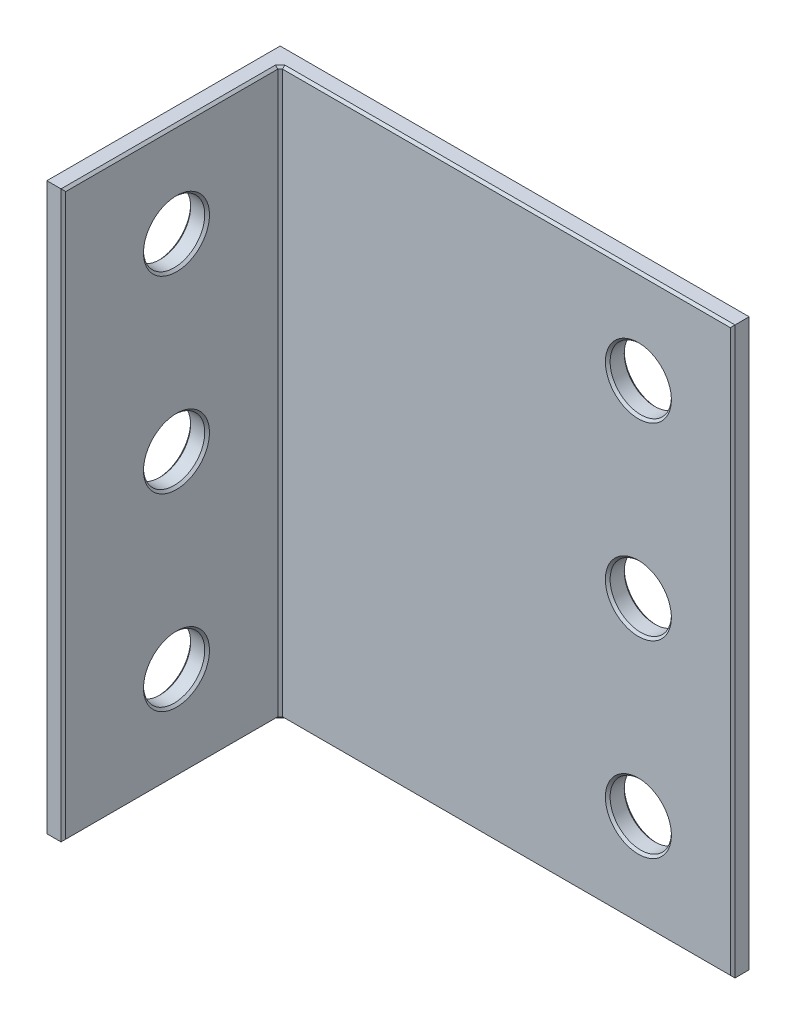
ISO-10303-21;
HEADER;
FILE_DESCRIPTION(('STEP AP214'),'2;1');
FILE_NAME('part.step','',(''),(''),'','','');
FILE_SCHEMA(('AUTOMOTIVE_DESIGN { 1 0 10303 214 1 1 1 1 }'));
ENDSEC;
DATA;
#1=APPLICATION_CONTEXT('core data for automotive mechanical design processes');
#2=APPLICATION_PROTOCOL_DEFINITION('international standard','automotive_design',2000,#1);
#3=PRODUCT_CONTEXT('',#1,'mechanical');
#4=PRODUCT('Part','Part','',(#3));
#5=PRODUCT_RELATED_PRODUCT_CATEGORY('part','',(#4));
#6=PRODUCT_DEFINITION_FORMATION('','',#4);
#7=PRODUCT_DEFINITION_CONTEXT('part definition',#1,'design');
#8=PRODUCT_DEFINITION('design','',#6,#7);
#9=PRODUCT_DEFINITION_SHAPE('','',#8);
#10=(LENGTH_UNIT() NAMED_UNIT(*) SI_UNIT(.MILLI.,.METRE.));
#11=(NAMED_UNIT(*) PLANE_ANGLE_UNIT() SI_UNIT($,.RADIAN.));
#12=(NAMED_UNIT(*) SI_UNIT($,.STERADIAN.) SOLID_ANGLE_UNIT());
#13=UNCERTAINTY_MEASURE_WITH_UNIT(LENGTH_MEASURE(1.E-05),#10,'distance_accuracy_value','');
#14=(GEOMETRIC_REPRESENTATION_CONTEXT(3) GLOBAL_UNCERTAINTY_ASSIGNED_CONTEXT((#13)) GLOBAL_UNIT_ASSIGNED_CONTEXT((#10,
#11,#12)) REPRESENTATION_CONTEXT('',''));
#15=CARTESIAN_POINT('',(0.,0.,0.));
#16=DIRECTION('',(0.,0.,1.));
#17=DIRECTION('',(1.,0.,0.));
#18=AXIS2_PLACEMENT_3D('',#15,#16,#17);
#19=CARTESIAN_POINT('',(0.,0.,8.));
#20=DIRECTION('',(0.,1.,0.));
#21=DIRECTION('',(0.,0.,1.));
#22=AXIS2_PLACEMENT_3D('',#19,#20,#21);
#23=PLANE('',#22);
#24=DIRECTION('',(0.,0.,-1.));
#25=VECTOR('',#24,1.);
#26=CARTESIAN_POINT('',(1.,0.,8.));
#27=LINE('',#26,#25);
#28=CARTESIAN_POINT('',(1.,0.,100.));
#29=VERTEX_POINT('',#28);
#30=CARTESIAN_POINT('',(1.,0.,1.));
#31=VERTEX_POINT('',#30);
#32=EDGE_CURVE('E338',#29,#31,#27,.T.);
#33=ORIENTED_EDGE('',*,*,#32,.T.);
#34=DIRECTION('',(1.,0.,0.));
#35=VECTOR('',#34,1.);
#36=CARTESIAN_POINT('',(200.,0.,1.));
#37=LINE('',#36,#35);
#38=CARTESIAN_POINT('',(200.,0.,1.));
#39=VERTEX_POINT('',#38);
#40=EDGE_CURVE('E340',#31,#39,#37,.T.);
#41=ORIENTED_EDGE('',*,*,#40,.T.);
#42=DIRECTION('',(0.,0.,-1.));
#43=VECTOR('',#42,1.);
#44=CARTESIAN_POINT('',(200.,0.,8.));
#45=LINE('',#44,#43);
#46=CARTESIAN_POINT('',(200.,0.,6.99999999999999));
#47=VERTEX_POINT('',#46);
#48=EDGE_CURVE('E352',#47,#39,#45,.T.);
#49=ORIENTED_EDGE('',*,*,#48,.F.);
#50=DIRECTION('',(-1.,0.,0.));
#51=VECTOR('',#50,1.);
#52=CARTESIAN_POINT('',(0.,0.,6.99999999999999));
#53=LINE('',#52,#51);
#54=CARTESIAN_POINT('',(9.00000000000002,0.,6.99999999999999));
#55=VERTEX_POINT('',#54);
#56=EDGE_CURVE('E334',#47,#55,#53,.T.);
#57=ORIENTED_EDGE('',*,*,#56,.T.);
#58=DIRECTION('',(0.707106781186544,0.,-0.707106781186551));
#59=VECTOR('',#58,1.);
#60=CARTESIAN_POINT('',(9.00000000000002,0.,6.99999999999999));
#61=LINE('',#60,#59);
#62=CARTESIAN_POINT('',(8.00000000000001,0.,8.));
#63=VERTEX_POINT('',#62);
#64=EDGE_CURVE('E330',#63,#55,#61,.T.);
#65=ORIENTED_EDGE('',*,*,#64,.F.);
#66=DIRECTION('',(0.707106781186544,0.,-0.707106781186551));
#67=VECTOR('',#66,1.);
#68=CARTESIAN_POINT('',(9.00000000000002,0.,6.99999999999999));
#69=LINE('',#68,#67);
#70=CARTESIAN_POINT('',(7.00000000000003,0.,9.00000000000001));
#71=VERTEX_POINT('',#70);
#72=EDGE_CURVE('E287',#71,#63,#69,.T.);
#73=ORIENTED_EDGE('',*,*,#72,.F.);
#74=DIRECTION('',(0.,0.,1.));
#75=VECTOR('',#74,1.);
#76=CARTESIAN_POINT('',(7.00000000000003,0.,8.));
#77=LINE('',#76,#75);
#78=CARTESIAN_POINT('',(7.00000000000003,0.,100.));
#79=VERTEX_POINT('',#78);
#80=EDGE_CURVE('E292',#71,#79,#77,.T.);
#81=ORIENTED_EDGE('',*,*,#80,.T.);
#82=DIRECTION('',(1.,0.,0.));
#83=VECTOR('',#82,1.);
#84=CARTESIAN_POINT('',(0.,0.,100.));
#85=LINE('',#84,#83);
#86=EDGE_CURVE('E256',#29,#79,#85,.T.);
#87=ORIENTED_EDGE('',*,*,#86,.F.);
#88=EDGE_LOOP('',(#33,#41,#49,#57,#65,#73,#81,#87));
#89=FACE_BOUND('',#88,.T.);
#90=ADVANCED_FACE('F32',(#89),#23,.F.);
#91=CARTESIAN_POINT('',(0.,240.,8.));
#92=DIRECTION('',(0.,0.,-1.));
#93=DIRECTION('',(-1.,0.,0.));
#94=AXIS2_PLACEMENT_3D('',#91,#92,#93);
#95=PLANE('',#94);
#96=CARTESIAN_POINT('',(160.,120.,8.));
#97=DIRECTION('',(0.,0.,-1.));
#98=DIRECTION('',(-1.,0.,0.));
#99=AXIS2_PLACEMENT_3D('',#96,#97,#98);
#100=CIRCLE('',#99,14.);
#101=CARTESIAN_POINT('',(146.,120.,8.));
#102=VERTEX_POINT('',#101);
#103=EDGE_CURVE('E325',#102,#102,#100,.T.);
#104=ORIENTED_EDGE('',*,*,#103,.T.);
#105=EDGE_LOOP('',(#104));
#106=FACE_BOUND('',#105,.T.);
#107=CARTESIAN_POINT('',(160.,40.,8.));
#108=DIRECTION('',(0.,0.,-1.));
#109=DIRECTION('',(-1.,0.,0.));
#110=AXIS2_PLACEMENT_3D('',#107,#108,#109);
#111=CIRCLE('',#110,14.);
#112=CARTESIAN_POINT('',(146.,40.,8.));
#113=VERTEX_POINT('',#112);
#114=EDGE_CURVE('E318',#113,#113,#111,.T.);
#115=ORIENTED_EDGE('',*,*,#114,.T.);
#116=EDGE_LOOP('',(#115));
#117=FACE_BOUND('',#116,.T.);
#118=CARTESIAN_POINT('',(160.,200.,8.));
#119=DIRECTION('',(0.,0.,-1.));
#120=DIRECTION('',(-1.,0.,0.));
#121=AXIS2_PLACEMENT_3D('',#118,#119,#120);
#122=CIRCLE('',#121,14.);
#123=CARTESIAN_POINT('',(146.,200.,8.));
#124=VERTEX_POINT('',#123);
#125=EDGE_CURVE('E315',#124,#124,#122,.T.);
#126=ORIENTED_EDGE('',*,*,#125,.T.);
#127=EDGE_LOOP('',(#126));
#128=FACE_BOUND('',#127,.T.);
#129=DIRECTION('',(0.,1.,0.));
#130=VECTOR('',#129,1.);
#131=CARTESIAN_POINT('',(199.,240.,8.));
#132=LINE('',#131,#130);
#133=CARTESIAN_POINT('',(199.,1.,8.));
#134=VERTEX_POINT('',#133);
#135=CARTESIAN_POINT('',(199.,239.,8.));
#136=VERTEX_POINT('',#135);
#137=EDGE_CURVE('E312',#134,#136,#132,.T.);
#138=ORIENTED_EDGE('',*,*,#137,.T.);
#139=DIRECTION('',(-1.,0.,0.));
#140=VECTOR('',#139,1.);
#141=CARTESIAN_POINT('',(0.,239.,8.));
#142=LINE('',#141,#140);
#143=CARTESIAN_POINT('',(9.,239.,8.));
#144=VERTEX_POINT('',#143);
#145=EDGE_CURVE('E309',#136,#144,#142,.T.);
#146=ORIENTED_EDGE('',*,*,#145,.T.);
#147=DIRECTION('',(0.,-1.,0.));
#148=VECTOR('',#147,1.);
#149=CARTESIAN_POINT('',(9.00000000000002,0.,8.));
#150=LINE('',#149,#148);
#151=CARTESIAN_POINT('',(9.00000000000002,1.,8.));
#152=VERTEX_POINT('',#151);
#153=EDGE_CURVE('E302',#144,#152,#150,.T.);
#154=ORIENTED_EDGE('',*,*,#153,.T.);
#155=DIRECTION('',(1.,0.,0.));
#156=VECTOR('',#155,1.);
#157=CARTESIAN_POINT('',(0.,1.,8.));
#158=LINE('',#157,#156);
#159=EDGE_CURVE('E305',#152,#134,#158,.T.);
#160=ORIENTED_EDGE('',*,*,#159,.T.);
#161=EDGE_LOOP('',(#138,#146,#154,#160));
#162=FACE_BOUND('',#161,.T.);
#163=ADVANCED_FACE('F310',(#106,#117,#128,#162),#95,.F.);
#164=CARTESIAN_POINT('',(0.,240.,0.));
#165=DIRECTION('',(0.,0.,-1.));
#166=DIRECTION('',(-1.,0.,0.));
#167=AXIS2_PLACEMENT_3D('',#164,#165,#166);
#168=PLANE('',#167);
#169=CARTESIAN_POINT('',(160.,200.,0.));
#170=DIRECTION('',(0.,0.,-1.));
#171=DIRECTION('',(-1.,0.,0.));
#172=AXIS2_PLACEMENT_3D('',#169,#170,#171);
#173=CIRCLE('',#172,14.);
#174=CARTESIAN_POINT('',(146.,200.,0.));
#175=VERTEX_POINT('',#174);
#176=EDGE_CURVE('E384',#175,#175,#173,.F.);
#177=ORIENTED_EDGE('',*,*,#176,.T.);
#178=EDGE_LOOP('',(#177));
#179=FACE_BOUND('',#178,.T.);
#180=CARTESIAN_POINT('',(160.,40.,0.));
#181=DIRECTION('',(0.,0.,-1.));
#182=DIRECTION('',(-1.,0.,0.));
#183=AXIS2_PLACEMENT_3D('',#180,#181,#182);
#184=CIRCLE('',#183,14.);
#185=CARTESIAN_POINT('',(146.,40.,0.));
#186=VERTEX_POINT('',#185);
#187=EDGE_CURVE('E381',#186,#186,#184,.F.);
#188=ORIENTED_EDGE('',*,*,#187,.T.);
#189=EDGE_LOOP('',(#188));
#190=FACE_BOUND('',#189,.T.);
#191=CARTESIAN_POINT('',(160.,120.,0.));
#192=DIRECTION('',(0.,0.,-1.));
#193=DIRECTION('',(-1.,0.,0.));
#194=AXIS2_PLACEMENT_3D('',#191,#192,#193);
#195=CIRCLE('',#194,14.);
#196=CARTESIAN_POINT('',(146.,120.,0.));
#197=VERTEX_POINT('',#196);
#198=EDGE_CURVE('E373',#197,#197,#195,.F.);
#199=ORIENTED_EDGE('',*,*,#198,.T.);
#200=EDGE_LOOP('',(#199));
#201=FACE_BOUND('',#200,.T.);
#202=DIRECTION('',(0.,-1.,0.));
#203=VECTOR('',#202,1.);
#204=CARTESIAN_POINT('',(199.,0.,0.));
#205=LINE('',#204,#203);
#206=CARTESIAN_POINT('',(199.,239.,0.));
#207=VERTEX_POINT('',#206);
#208=CARTESIAN_POINT('',(199.,1.,0.));
#209=VERTEX_POINT('',#208);
#210=EDGE_CURVE('E366',#207,#209,#205,.T.);
#211=ORIENTED_EDGE('',*,*,#210,.T.);
#212=DIRECTION('',(-1.,0.,0.));
#213=VECTOR('',#212,1.);
#214=CARTESIAN_POINT('',(0.,1.,0.));
#215=LINE('',#214,#213);
#216=CARTESIAN_POINT('',(1.,1.,0.));
#217=VERTEX_POINT('',#216);
#218=EDGE_CURVE('E370',#209,#217,#215,.T.);
#219=ORIENTED_EDGE('',*,*,#218,.T.);
#220=DIRECTION('',(0.,1.,0.));
#221=VECTOR('',#220,1.);
#222=CARTESIAN_POINT('',(1.,240.,0.));
#223=LINE('',#222,#221);
#224=CARTESIAN_POINT('',(1.,239.,0.));
#225=VERTEX_POINT('',#224);
#226=EDGE_CURVE('E375',#217,#225,#223,.T.);
#227=ORIENTED_EDGE('',*,*,#226,.T.);
#228=DIRECTION('',(1.,0.,0.));
#229=VECTOR('',#228,1.);
#230=CARTESIAN_POINT('',(200.,239.,0.));
#231=LINE('',#230,#229);
#232=EDGE_CURVE('E371',#225,#207,#231,.T.);
#233=ORIENTED_EDGE('',*,*,#232,.T.);
#234=EDGE_LOOP('',(#211,#219,#227,#233));
#235=FACE_BOUND('',#234,.T.);
#236=ADVANCED_FACE('F430',(#179,#190,#201,#235),#168,.T.);
#237=CARTESIAN_POINT('',(0.,0.,8.));
#238=DIRECTION('',(1.,0.,0.));
#239=DIRECTION('',(0.,0.,-1.));
#240=AXIS2_PLACEMENT_3D('',#237,#238,#239);
#241=PLANE('',#240);
#242=DIRECTION('',(0.,1.,0.));
#243=VECTOR('',#242,1.);
#244=CARTESIAN_POINT('',(0.,240.,99.));
#245=LINE('',#244,#243);
#246=CARTESIAN_POINT('',(0.,1.,99.));
#247=VERTEX_POINT('',#246);
#248=CARTESIAN_POINT('',(0.,239.,99.));
#249=VERTEX_POINT('',#248);
#250=EDGE_CURVE('E188',#247,#249,#245,.T.);
#251=ORIENTED_EDGE('',*,*,#250,.T.);
#252=DIRECTION('',(0.,0.,-1.));
#253=VECTOR('',#252,1.);
#254=CARTESIAN_POINT('',(0.,239.,8.));
#255=LINE('',#254,#253);
#256=CARTESIAN_POINT('',(0.,239.,1.));
#257=VERTEX_POINT('',#256);
#258=EDGE_CURVE('E190',#249,#257,#255,.T.);
#259=ORIENTED_EDGE('',*,*,#258,.T.);
#260=DIRECTION('',(0.,-1.,0.));
#261=VECTOR('',#260,1.);
#262=CARTESIAN_POINT('',(0.,0.,1.));
#263=LINE('',#262,#261);
#264=CARTESIAN_POINT('',(0.,1.,1.));
#265=VERTEX_POINT('',#264);
#266=EDGE_CURVE('E184',#257,#265,#263,.T.);
#267=ORIENTED_EDGE('',*,*,#266,.T.);
#268=DIRECTION('',(0.,0.,1.));
#269=VECTOR('',#268,1.);
#270=CARTESIAN_POINT('',(0.,1.,8.));
#271=LINE('',#270,#269);
#272=EDGE_CURVE('E186',#265,#247,#271,.T.);
#273=ORIENTED_EDGE('',*,*,#272,.T.);
#274=EDGE_LOOP('',(#251,#259,#267,#273));
#275=FACE_BOUND('',#274,.T.);
#276=CARTESIAN_POINT('',(0.,200.,52.));
#277=DIRECTION('',(1.,0.,0.));
#278=DIRECTION('',(0.,0.,-1.));
#279=AXIS2_PLACEMENT_3D('',#276,#277,#278);
#280=CIRCLE('',#279,14.);
#281=CARTESIAN_POINT('',(0.,200.,38.));
#282=VERTEX_POINT('',#281);
#283=EDGE_CURVE('E181',#282,#282,#280,.T.);
#284=ORIENTED_EDGE('',*,*,#283,.T.);
#285=EDGE_LOOP('',(#284));
#286=FACE_BOUND('',#285,.T.);
#287=CARTESIAN_POINT('',(0.,120.,52.));
#288=DIRECTION('',(1.,0.,0.));
#289=DIRECTION('',(0.,0.,-1.));
#290=AXIS2_PLACEMENT_3D('',#287,#288,#289);
#291=CIRCLE('',#290,14.);
#292=CARTESIAN_POINT('',(0.,120.,38.));
#293=VERTEX_POINT('',#292);
#294=EDGE_CURVE('E178',#293,#293,#291,.T.);
#295=ORIENTED_EDGE('',*,*,#294,.T.);
#296=EDGE_LOOP('',(#295));
#297=FACE_BOUND('',#296,.T.);
#298=CARTESIAN_POINT('',(0.,40.,52.));
#299=DIRECTION('',(1.,0.,0.));
#300=DIRECTION('',(0.,0.,-1.));
#301=AXIS2_PLACEMENT_3D('',#298,#299,#300);
#302=CIRCLE('',#301,14.);
#303=CARTESIAN_POINT('',(0.,40.,38.));
#304=VERTEX_POINT('',#303);
#305=EDGE_CURVE('E175',#304,#304,#302,.T.);
#306=ORIENTED_EDGE('',*,*,#305,.T.);
#307=EDGE_LOOP('',(#306));
#308=FACE_BOUND('',#307,.T.);
#309=ADVANCED_FACE('F436',(#275,#286,#297,#308),#241,.F.);
#310=CARTESIAN_POINT('',(200.,0.,8.));
#311=DIRECTION('',(-1.,0.,0.));
#312=DIRECTION('',(0.,0.,1.));
#313=AXIS2_PLACEMENT_3D('',#310,#311,#312);
#314=PLANE('',#313);
#315=ORIENTED_EDGE('',*,*,#48,.T.);
#316=DIRECTION('',(0.,1.,0.));
#317=VECTOR('',#316,1.);
#318=CARTESIAN_POINT('',(200.,240.,1.));
#319=LINE('',#318,#317);
#320=CARTESIAN_POINT('',(200.,240.,1.));
#321=VERTEX_POINT('',#320);
#322=EDGE_CURVE('E156',#39,#321,#319,.T.);
#323=ORIENTED_EDGE('',*,*,#322,.T.);
#324=DIRECTION('',(0.,0.,-1.));
#325=VECTOR('',#324,1.);
#326=CARTESIAN_POINT('',(200.,240.,8.));
#327=LINE('',#326,#325);
#328=CARTESIAN_POINT('',(200.,240.,6.99999999999999));
#329=VERTEX_POINT('',#328);
#330=EDGE_CURVE('E350',#329,#321,#327,.T.);
#331=ORIENTED_EDGE('',*,*,#330,.F.);
#332=DIRECTION('',(0.,-1.,0.));
#333=VECTOR('',#332,1.);
#334=CARTESIAN_POINT('',(200.,0.,6.99999999999999));
#335=LINE('',#334,#333);
#336=EDGE_CURVE('E343',#329,#47,#335,.T.);
#337=ORIENTED_EDGE('',*,*,#336,.T.);
#338=EDGE_LOOP('',(#315,#323,#331,#337));
#339=FACE_BOUND('',#338,.T.);
#340=ADVANCED_FACE('F349',(#339),#314,.F.);
#341=CARTESIAN_POINT('',(0.,240.,8.));
#342=DIRECTION('',(0.,-1.,0.));
#343=DIRECTION('',(0.,0.,-1.));
#344=AXIS2_PLACEMENT_3D('',#341,#342,#343);
#345=PLANE('',#344);
#346=ORIENTED_EDGE('',*,*,#330,.T.);
#347=DIRECTION('',(-1.,0.,0.));
#348=VECTOR('',#347,1.);
#349=CARTESIAN_POINT('',(0.,240.,1.));
#350=LINE('',#349,#348);
#351=CARTESIAN_POINT('',(1.,240.,1.));
#352=VERTEX_POINT('',#351);
#353=EDGE_CURVE('E173',#321,#352,#350,.T.);
#354=ORIENTED_EDGE('',*,*,#353,.T.);
#355=DIRECTION('',(0.,0.,1.));
#356=VECTOR('',#355,1.);
#357=CARTESIAN_POINT('',(1.,240.,8.));
#358=LINE('',#357,#356);
#359=CARTESIAN_POINT('',(1.,240.,100.));
#360=VERTEX_POINT('',#359);
#361=EDGE_CURVE('E171',#352,#360,#358,.T.);
#362=ORIENTED_EDGE('',*,*,#361,.T.);
#363=DIRECTION('',(-1.,0.,0.));
#364=VECTOR('',#363,1.);
#365=CARTESIAN_POINT('',(0.,240.,100.));
#366=LINE('',#365,#364);
#367=CARTESIAN_POINT('',(7.,240.,100.));
#368=VERTEX_POINT('',#367);
#369=EDGE_CURVE('E357',#368,#360,#366,.T.);
#370=ORIENTED_EDGE('',*,*,#369,.F.);
#371=DIRECTION('',(0.,0.,-1.));
#372=VECTOR('',#371,1.);
#373=CARTESIAN_POINT('',(7.,240.,8.));
#374=LINE('',#373,#372);
#375=CARTESIAN_POINT('',(7.,240.,9.00000000000001));
#376=VERTEX_POINT('',#375);
#377=EDGE_CURVE('E152',#368,#376,#374,.T.);
#378=ORIENTED_EDGE('',*,*,#377,.T.);
#379=DIRECTION('',(-0.707106781186544,0.,0.707106781186551));
#380=VECTOR('',#379,1.);
#381=CARTESIAN_POINT('',(7.,240.,9.00000000000001));
#382=LINE('',#381,#380);
#383=CARTESIAN_POINT('',(8.,240.,8.));
#384=VERTEX_POINT('',#383);
#385=EDGE_CURVE('E143',#384,#376,#382,.T.);
#386=ORIENTED_EDGE('',*,*,#385,.F.);
#387=DIRECTION('',(-0.707106781186544,0.,0.707106781186551));
#388=VECTOR('',#387,1.);
#389=CARTESIAN_POINT('',(7.,240.,9.00000000000001));
#390=LINE('',#389,#388);
#391=CARTESIAN_POINT('',(9.,240.,6.99999999999999));
#392=VERTEX_POINT('',#391);
#393=EDGE_CURVE('E148',#392,#384,#390,.T.);
#394=ORIENTED_EDGE('',*,*,#393,.F.);
#395=DIRECTION('',(1.,0.,0.));
#396=VECTOR('',#395,1.);
#397=CARTESIAN_POINT('',(0.,240.,6.99999999999999));
#398=LINE('',#397,#396);
#399=EDGE_CURVE('E163',#392,#329,#398,.T.);
#400=ORIENTED_EDGE('',*,*,#399,.T.);
#401=EDGE_LOOP('',(#346,#354,#362,#370,#378,#386,#394,#400));
#402=FACE_BOUND('',#401,.T.);
#403=ADVANCED_FACE('F146',(#402),#345,.F.);
#404=CARTESIAN_POINT('',(160.,40.,8.));
#405=DIRECTION('',(0.,0.,-1.));
#406=DIRECTION('',(-1.,0.,0.));
#407=AXIS2_PLACEMENT_3D('',#404,#405,#406);
#408=CYLINDRICAL_SURFACE('',#407,13.);
#409=CARTESIAN_POINT('',(160.,40.,1.00000000000001));
#410=DIRECTION('',(0.,0.,-1.));
#411=DIRECTION('',(-1.,0.,0.));
#412=AXIS2_PLACEMENT_3D('',#409,#410,#411);
#413=CIRCLE('',#412,13.);
#414=CARTESIAN_POINT('',(147.,40.,1.00000000000001));
#415=VERTEX_POINT('',#414);
#416=EDGE_CURVE('E396',#415,#415,#413,.T.);
#417=ORIENTED_EDGE('',*,*,#416,.T.);
#418=EDGE_LOOP('',(#417));
#419=FACE_BOUND('',#418,.T.);
#420=CARTESIAN_POINT('',(160.,40.,6.99999999999999));
#421=DIRECTION('',(0.,0.,-1.));
#422=DIRECTION('',(-1.,0.,0.));
#423=AXIS2_PLACEMENT_3D('',#420,#421,#422);
#424=CIRCLE('',#423,13.);
#425=CARTESIAN_POINT('',(147.,40.,6.99999999999999));
#426=VERTEX_POINT('',#425);
#427=EDGE_CURVE('E393',#426,#426,#424,.F.);
#428=ORIENTED_EDGE('',*,*,#427,.T.);
#429=EDGE_LOOP('',(#428));
#430=FACE_BOUND('',#429,.T.);
#431=ADVANCED_FACE('F543',(#419,#430),#408,.F.);
#432=CARTESIAN_POINT('',(160.,120.,8.));
#433=DIRECTION('',(0.,0.,-1.));
#434=DIRECTION('',(-1.,0.,0.));
#435=AXIS2_PLACEMENT_3D('',#432,#433,#434);
#436=CYLINDRICAL_SURFACE('',#435,13.);
#437=CARTESIAN_POINT('',(160.,120.,1.00000000000001));
#438=DIRECTION('',(0.,0.,-1.));
#439=DIRECTION('',(-1.,0.,0.));
#440=AXIS2_PLACEMENT_3D('',#437,#438,#439);
#441=CIRCLE('',#440,13.);
#442=CARTESIAN_POINT('',(147.,120.,1.00000000000001));
#443=VERTEX_POINT('',#442);
#444=EDGE_CURVE('E306',#443,#443,#441,.T.);
#445=ORIENTED_EDGE('',*,*,#444,.T.);
#446=EDGE_LOOP('',(#445));
#447=FACE_BOUND('',#446,.T.);
#448=CARTESIAN_POINT('',(160.,120.,6.99999999999999));
#449=DIRECTION('',(0.,0.,-1.));
#450=DIRECTION('',(-1.,0.,0.));
#451=AXIS2_PLACEMENT_3D('',#448,#449,#450);
#452=CIRCLE('',#451,13.);
#453=CARTESIAN_POINT('',(147.,120.,6.99999999999999));
#454=VERTEX_POINT('',#453);
#455=EDGE_CURVE('E399',#454,#454,#452,.F.);
#456=ORIENTED_EDGE('',*,*,#455,.T.);
#457=EDGE_LOOP('',(#456));
#458=FACE_BOUND('',#457,.T.);
#459=ADVANCED_FACE('F536',(#447,#458),#436,.F.);
#460=CARTESIAN_POINT('',(160.,200.,8.));
#461=DIRECTION('',(0.,0.,-1.));
#462=DIRECTION('',(-1.,0.,0.));
#463=AXIS2_PLACEMENT_3D('',#460,#461,#462);
#464=CYLINDRICAL_SURFACE('',#463,13.);
#465=CARTESIAN_POINT('',(160.,200.,1.));
#466=DIRECTION('',(0.,0.,-1.));
#467=DIRECTION('',(-1.,0.,0.));
#468=AXIS2_PLACEMENT_3D('',#465,#466,#467);
#469=CIRCLE('',#468,13.);
#470=CARTESIAN_POINT('',(147.,200.,1.));
#471=VERTEX_POINT('',#470);
#472=EDGE_CURVE('E390',#471,#471,#469,.T.);
#473=ORIENTED_EDGE('',*,*,#472,.T.);
#474=EDGE_LOOP('',(#473));
#475=FACE_BOUND('',#474,.T.);
#476=CARTESIAN_POINT('',(160.,200.,6.99999999999999));
#477=DIRECTION('',(0.,0.,-1.));
#478=DIRECTION('',(-1.,0.,0.));
#479=AXIS2_PLACEMENT_3D('',#476,#477,#478);
#480=CIRCLE('',#479,13.);
#481=CARTESIAN_POINT('',(147.,200.,6.99999999999999));
#482=VERTEX_POINT('',#481);
#483=EDGE_CURVE('E387',#482,#482,#480,.F.);
#484=ORIENTED_EDGE('',*,*,#483,.T.);
#485=EDGE_LOOP('',(#484));
#486=FACE_BOUND('',#485,.T.);
#487=ADVANCED_FACE('F527',(#475,#486),#464,.F.);
#488=CARTESIAN_POINT('',(8.,240.,100.));
#489=DIRECTION('',(-1.,0.,0.));
#490=DIRECTION('',(0.,-1.,0.));
#491=AXIS2_PLACEMENT_3D('',#488,#489,#490);
#492=PLANE('',#491);
#493=DIRECTION('',(0.,-1.,0.));
#494=VECTOR('',#493,1.);
#495=CARTESIAN_POINT('',(8.00000000000003,0.,99.));
#496=LINE('',#495,#494);
#497=CARTESIAN_POINT('',(8.,239.,99.));
#498=VERTEX_POINT('',#497);
#499=CARTESIAN_POINT('',(8.00000000000003,1.,99.));
#500=VERTEX_POINT('',#499);
#501=EDGE_CURVE('E41',#498,#500,#496,.T.);
#502=ORIENTED_EDGE('',*,*,#501,.T.);
#503=DIRECTION('',(0.,0.,-1.));
#504=VECTOR('',#503,1.);
#505=CARTESIAN_POINT('',(8.00000000000003,1.,100.));
#506=LINE('',#505,#504);
#507=CARTESIAN_POINT('',(8.00000000000003,1.,9.00000000000001));
#508=VERTEX_POINT('',#507);
#509=EDGE_CURVE('E11',#500,#508,#506,.T.);
#510=ORIENTED_EDGE('',*,*,#509,.T.);
#511=DIRECTION('',(0.,1.,0.));
#512=VECTOR('',#511,1.);
#513=CARTESIAN_POINT('',(8.,240.,9.00000000000001));
#514=LINE('',#513,#512);
#515=CARTESIAN_POINT('',(8.,239.,9.00000000000001));
#516=VERTEX_POINT('',#515);
#517=EDGE_CURVE('E224',#508,#516,#514,.T.);
#518=ORIENTED_EDGE('',*,*,#517,.T.);
#519=DIRECTION('',(0.,0.,1.));
#520=VECTOR('',#519,1.);
#521=CARTESIAN_POINT('',(8.,239.,100.));
#522=LINE('',#521,#520);
#523=EDGE_CURVE('E52',#516,#498,#522,.T.);
#524=ORIENTED_EDGE('',*,*,#523,.T.);
#525=EDGE_LOOP('',(#502,#510,#518,#524));
#526=FACE_BOUND('',#525,.T.);
#527=CARTESIAN_POINT('',(8.00000000000001,200.,52.));
#528=DIRECTION('',(-1.,0.,0.));
#529=DIRECTION('',(0.,-1.,0.));
#530=AXIS2_PLACEMENT_3D('',#527,#528,#529);
#531=CIRCLE('',#530,14.);
#532=CARTESIAN_POINT('',(8.00000000000001,186.,52.));
#533=VERTEX_POINT('',#532);
#534=EDGE_CURVE('E221',#533,#533,#531,.T.);
#535=ORIENTED_EDGE('',*,*,#534,.T.);
#536=EDGE_LOOP('',(#535));
#537=FACE_BOUND('',#536,.T.);
#538=CARTESIAN_POINT('',(8.00000000000001,120.,52.));
#539=DIRECTION('',(-1.,0.,0.));
#540=DIRECTION('',(0.,-1.,0.));
#541=AXIS2_PLACEMENT_3D('',#538,#539,#540);
#542=CIRCLE('',#541,14.);
#543=CARTESIAN_POINT('',(8.00000000000002,106.,52.));
#544=VERTEX_POINT('',#543);
#545=EDGE_CURVE('E218',#544,#544,#542,.T.);
#546=ORIENTED_EDGE('',*,*,#545,.T.);
#547=EDGE_LOOP('',(#546));
#548=FACE_BOUND('',#547,.T.);
#549=CARTESIAN_POINT('',(8.00000000000002,40.,52.));
#550=DIRECTION('',(-1.,0.,0.));
#551=DIRECTION('',(0.,-1.,0.));
#552=AXIS2_PLACEMENT_3D('',#549,#550,#551);
#553=CIRCLE('',#552,14.);
#554=CARTESIAN_POINT('',(8.00000000000002,26.,52.));
#555=VERTEX_POINT('',#554);
#556=EDGE_CURVE('E215',#555,#555,#553,.T.);
#557=ORIENTED_EDGE('',*,*,#556,.T.);
#558=EDGE_LOOP('',(#557));
#559=FACE_BOUND('',#558,.T.);
#560=ADVANCED_FACE('F293',(#526,#537,#548,#559),#492,.F.);
#561=CARTESIAN_POINT('',(0.,0.,100.));
#562=DIRECTION('',(0.,0.,1.));
#563=DIRECTION('',(1.,0.,0.));
#564=AXIS2_PLACEMENT_3D('',#561,#562,#563);
#565=PLANE('',#564);
#566=ORIENTED_EDGE('',*,*,#369,.T.);
#567=DIRECTION('',(0.,-1.,0.));
#568=VECTOR('',#567,1.);
#569=CARTESIAN_POINT('',(1.,0.,100.));
#570=LINE('',#569,#568);
#571=EDGE_CURVE('E195',#360,#29,#570,.T.);
#572=ORIENTED_EDGE('',*,*,#571,.T.);
#573=ORIENTED_EDGE('',*,*,#86,.T.);
#574=DIRECTION('',(0.,1.,0.));
#575=VECTOR('',#574,1.);
#576=CARTESIAN_POINT('',(7.,240.,100.));
#577=LINE('',#576,#575);
#578=EDGE_CURVE('E193',#79,#368,#577,.T.);
#579=ORIENTED_EDGE('',*,*,#578,.T.);
#580=EDGE_LOOP('',(#566,#572,#573,#579));
#581=FACE_BOUND('',#580,.T.);
#582=ADVANCED_FACE('F526',(#581),#565,.T.);
#583=CARTESIAN_POINT('',(200.000025,200.,52.));
#584=DIRECTION('',(-1.,0.,0.));
#585=DIRECTION('',(0.,0.,1.));
#586=AXIS2_PLACEMENT_3D('',#583,#584,#585);
#587=CYLINDRICAL_SURFACE('',#586,13.);
#588=CARTESIAN_POINT('',(1.,200.,52.));
#589=DIRECTION('',(1.,0.,0.));
#590=DIRECTION('',(0.,0.,-1.));
#591=AXIS2_PLACEMENT_3D('',#588,#589,#590);
#592=CIRCLE('',#591,13.);
#593=CARTESIAN_POINT('',(1.,200.,39.));
#594=VERTEX_POINT('',#593);
#595=EDGE_CURVE('E200',#594,#594,#592,.F.);
#596=ORIENTED_EDGE('',*,*,#595,.T.);
#597=EDGE_LOOP('',(#596));
#598=FACE_BOUND('',#597,.T.);
#599=CARTESIAN_POINT('',(7.00000000000001,200.,52.));
#600=DIRECTION('',(-1.,0.,0.));
#601=DIRECTION('',(0.,0.,1.));
#602=AXIS2_PLACEMENT_3D('',#599,#600,#601);
#603=CIRCLE('',#602,13.);
#604=CARTESIAN_POINT('',(7.00000000000001,200.,65.));
#605=VERTEX_POINT('',#604);
#606=EDGE_CURVE('E197',#605,#605,#603,.F.);
#607=ORIENTED_EDGE('',*,*,#606,.T.);
#608=EDGE_LOOP('',(#607));
#609=FACE_BOUND('',#608,.T.);
#610=ADVANCED_FACE('F533',(#598,#609),#587,.F.);
#611=CARTESIAN_POINT('',(200.000025,120.,52.));
#612=DIRECTION('',(-1.,0.,0.));
#613=DIRECTION('',(0.,0.,1.));
#614=AXIS2_PLACEMENT_3D('',#611,#612,#613);
#615=CYLINDRICAL_SURFACE('',#614,13.);
#616=CARTESIAN_POINT('',(1.,120.,52.));
#617=DIRECTION('',(1.,0.,0.));
#618=DIRECTION('',(0.,0.,-1.));
#619=AXIS2_PLACEMENT_3D('',#616,#617,#618);
#620=CIRCLE('',#619,13.);
#621=CARTESIAN_POINT('',(1.,120.,39.));
#622=VERTEX_POINT('',#621);
#623=EDGE_CURVE('E206',#622,#622,#620,.F.);
#624=ORIENTED_EDGE('',*,*,#623,.T.);
#625=EDGE_LOOP('',(#624));
#626=FACE_BOUND('',#625,.T.);
#627=CARTESIAN_POINT('',(7.00000000000003,120.,52.));
#628=DIRECTION('',(-1.,0.,0.));
#629=DIRECTION('',(0.,0.,1.));
#630=AXIS2_PLACEMENT_3D('',#627,#628,#629);
#631=CIRCLE('',#630,13.);
#632=CARTESIAN_POINT('',(7.00000000000003,120.,65.));
#633=VERTEX_POINT('',#632);
#634=EDGE_CURVE('E203',#633,#633,#631,.F.);
#635=ORIENTED_EDGE('',*,*,#634,.T.);
#636=EDGE_LOOP('',(#635));
#637=FACE_BOUND('',#636,.T.);
#638=ADVANCED_FACE('F517',(#626,#637),#615,.F.);
#639=CARTESIAN_POINT('',(200.000025,40.,52.));
#640=DIRECTION('',(-1.,0.,0.));
#641=DIRECTION('',(0.,0.,1.));
#642=AXIS2_PLACEMENT_3D('',#639,#640,#641);
#643=CYLINDRICAL_SURFACE('',#642,13.);
#644=CARTESIAN_POINT('',(1.,40.,52.));
#645=DIRECTION('',(1.,0.,0.));
#646=DIRECTION('',(0.,0.,-1.));
#647=AXIS2_PLACEMENT_3D('',#644,#645,#646);
#648=CIRCLE('',#647,13.);
#649=CARTESIAN_POINT('',(1.,40.,39.));
#650=VERTEX_POINT('',#649);
#651=EDGE_CURVE('E212',#650,#650,#648,.F.);
#652=ORIENTED_EDGE('',*,*,#651,.T.);
#653=EDGE_LOOP('',(#652));
#654=FACE_BOUND('',#653,.T.);
#655=CARTESIAN_POINT('',(7.00000000000001,40.,52.));
#656=DIRECTION('',(-1.,0.,0.));
#657=DIRECTION('',(0.,0.,1.));
#658=AXIS2_PLACEMENT_3D('',#655,#656,#657);
#659=CIRCLE('',#658,13.);
#660=CARTESIAN_POINT('',(7.00000000000001,40.,65.));
#661=VERTEX_POINT('',#660);
#662=EDGE_CURVE('E209',#661,#661,#659,.F.);
#663=ORIENTED_EDGE('',*,*,#662,.T.);
#664=EDGE_LOOP('',(#663));
#665=FACE_BOUND('',#664,.T.);
#666=ADVANCED_FACE('F444',(#654,#665),#643,.F.);
#667=CARTESIAN_POINT('',(160.,200.,0.));
#668=DIRECTION('',(0.,0.,-1.));
#669=DIRECTION('',(-1.,0.,0.));
#670=AXIS2_PLACEMENT_3D('',#667,#668,#669);
#671=CONICAL_SURFACE('',#670,14.,0.78539816339745);
#672=ORIENTED_EDGE('',*,*,#472,.F.);
#673=EDGE_LOOP('',(#672));
#674=FACE_BOUND('',#673,.T.);
#675=ORIENTED_EDGE('',*,*,#176,.F.);
#676=EDGE_LOOP('',(#675));
#677=FACE_BOUND('',#676,.T.);
#678=ADVANCED_FACE('F440',(#674,#677),#671,.F.);
#679=CARTESIAN_POINT('',(160.,40.,0.));
#680=DIRECTION('',(0.,0.,-1.));
#681=DIRECTION('',(-1.,0.,0.));
#682=AXIS2_PLACEMENT_3D('',#679,#680,#681);
#683=CONICAL_SURFACE('',#682,14.,0.785398163397448);
#684=ORIENTED_EDGE('',*,*,#416,.F.);
#685=EDGE_LOOP('',(#684));
#686=FACE_BOUND('',#685,.T.);
#687=ORIENTED_EDGE('',*,*,#187,.F.);
#688=EDGE_LOOP('',(#687));
#689=FACE_BOUND('',#688,.T.);
#690=ADVANCED_FACE('F443',(#686,#689),#683,.F.);
#691=CARTESIAN_POINT('',(160.,120.,0.));
#692=DIRECTION('',(0.,0.,-1.));
#693=DIRECTION('',(-1.,0.,0.));
#694=AXIS2_PLACEMENT_3D('',#691,#692,#693);
#695=CONICAL_SURFACE('',#694,14.,0.785398163397448);
#696=ORIENTED_EDGE('',*,*,#444,.F.);
#697=EDGE_LOOP('',(#696));
#698=FACE_BOUND('',#697,.T.);
#699=ORIENTED_EDGE('',*,*,#198,.F.);
#700=EDGE_LOOP('',(#699));
#701=FACE_BOUND('',#700,.T.);
#702=ADVANCED_FACE('F448',(#698,#701),#695,.F.);
#703=CARTESIAN_POINT('',(160.,120.,6.99999999999999));
#704=DIRECTION('',(0.,0.,1.));
#705=DIRECTION('',(1.,0.,0.));
#706=AXIS2_PLACEMENT_3D('',#703,#704,#705);
#707=CONICAL_SURFACE('',#706,13.,0.785398163397447);
#708=ORIENTED_EDGE('',*,*,#103,.F.);
#709=EDGE_LOOP('',(#708));
#710=FACE_BOUND('',#709,.T.);
#711=ORIENTED_EDGE('',*,*,#455,.F.);
#712=EDGE_LOOP('',(#711));
#713=FACE_BOUND('',#712,.T.);
#714=ADVANCED_FACE('F452',(#710,#713),#707,.F.);
#715=CARTESIAN_POINT('',(160.,40.,6.99999999999999));
#716=DIRECTION('',(0.,0.,1.));
#717=DIRECTION('',(1.,0.,0.));
#718=AXIS2_PLACEMENT_3D('',#715,#716,#717);
#719=CONICAL_SURFACE('',#718,13.,0.785398163397447);
#720=ORIENTED_EDGE('',*,*,#114,.F.);
#721=EDGE_LOOP('',(#720));
#722=FACE_BOUND('',#721,.T.);
#723=ORIENTED_EDGE('',*,*,#427,.F.);
#724=EDGE_LOOP('',(#723));
#725=FACE_BOUND('',#724,.T.);
#726=ADVANCED_FACE('F456',(#722,#725),#719,.F.);
#727=CARTESIAN_POINT('',(160.,200.,6.99999999999999));
#728=DIRECTION('',(0.,0.,1.));
#729=DIRECTION('',(1.,0.,0.));
#730=AXIS2_PLACEMENT_3D('',#727,#728,#729);
#731=CONICAL_SURFACE('',#730,13.,0.785398163397447);
#732=ORIENTED_EDGE('',*,*,#125,.F.);
#733=EDGE_LOOP('',(#732));
#734=FACE_BOUND('',#733,.T.);
#735=ORIENTED_EDGE('',*,*,#483,.F.);
#736=EDGE_LOOP('',(#735));
#737=FACE_BOUND('',#736,.T.);
#738=ADVANCED_FACE('F460',(#734,#737),#731,.F.);
#739=CARTESIAN_POINT('',(0.,239.,8.));
#740=DIRECTION('',(0.707106781186547,-0.707106781186549,0.));
#741=DIRECTION('',(0.707106781186549,0.707106781186547,0.));
#742=AXIS2_PLACEMENT_3D('',#739,#740,#741);
#743=PLANE('',#742);
#744=DIRECTION('',(-0.707106781186548,-0.707106781186547,0.));
#745=VECTOR('',#744,1.);
#746=CARTESIAN_POINT('',(1.,240.,1.));
#747=LINE('',#746,#745);
#748=EDGE_CURVE('E250',#257,#352,#747,.F.);
#749=ORIENTED_EDGE('',*,*,#748,.F.);
#750=ORIENTED_EDGE('',*,*,#258,.F.);
#751=DIRECTION('',(0.577350269189627,0.577350269189625,0.577350269189625));
#752=VECTOR('',#751,1.);
#753=CARTESIAN_POINT('',(-79.0000000000001,160.,20.0000000000002));
#754=LINE('',#753,#752);
#755=EDGE_CURVE('E253',#360,#249,#754,.F.);
#756=ORIENTED_EDGE('',*,*,#755,.F.);
#757=ORIENTED_EDGE('',*,*,#361,.F.);
#758=EDGE_LOOP('',(#749,#750,#756,#757));
#759=FACE_BOUND('',#758,.T.);
#760=ADVANCED_FACE('F464',(#759),#743,.F.);
#761=CARTESIAN_POINT('',(1.,0.,100.));
#762=DIRECTION('',(-0.707106781186547,0.,0.707106781186549));
#763=DIRECTION('',(0.707106781186549,0.,0.707106781186547));
#764=AXIS2_PLACEMENT_3D('',#761,#762,#763);
#765=PLANE('',#764);
#766=ORIENTED_EDGE('',*,*,#755,.T.);
#767=ORIENTED_EDGE('',*,*,#250,.F.);
#768=DIRECTION('',(0.577350269189627,-0.577350269189625,0.577350269189625));
#769=VECTOR('',#768,1.);
#770=CARTESIAN_POINT('',(-29.6666666666667,30.6666666666666,69.3333333333334));
#771=LINE('',#770,#769);
#772=EDGE_CURVE('E244',#29,#247,#771,.F.);
#773=ORIENTED_EDGE('',*,*,#772,.F.);
#774=ORIENTED_EDGE('',*,*,#571,.F.);
#775=EDGE_LOOP('',(#766,#767,#773,#774));
#776=FACE_BOUND('',#775,.T.);
#777=ADVANCED_FACE('F490',(#776),#765,.T.);
#778=CARTESIAN_POINT('',(1.,240.,1.));
#779=DIRECTION('',(-0.577350269189625,0.577350269189626,-0.577350269189627));
#780=DIRECTION('',(0.,0.707106781186548,0.707106781186547));
#781=AXIS2_PLACEMENT_3D('',#778,#779,#780);
#782=PLANE('',#781);
#783=DIRECTION('',(0.,-0.707106781186548,-0.707106781186547));
#784=VECTOR('',#783,1.);
#785=CARTESIAN_POINT('',(1.,240.,1.));
#786=LINE('',#785,#784);
#787=EDGE_CURVE('E241',#225,#352,#786,.F.);
#788=ORIENTED_EDGE('',*,*,#787,.F.);
#789=DIRECTION('',(-0.707106781186549,0.,0.707106781186546));
#790=VECTOR('',#789,1.);
#791=CARTESIAN_POINT('',(0.500000000000003,239.,0.499999999999998));
#792=LINE('',#791,#790);
#793=EDGE_CURVE('E247',#257,#225,#792,.F.);
#794=ORIENTED_EDGE('',*,*,#793,.F.);
#795=ORIENTED_EDGE('',*,*,#748,.T.);
#796=EDGE_LOOP('',(#788,#794,#795));
#797=FACE_BOUND('',#796,.T.);
#798=ADVANCED_FACE('F486',(#797),#782,.T.);
#799=CARTESIAN_POINT('',(0.,0.,1.));
#800=DIRECTION('',(-0.707106781186546,0.,-0.707106781186549));
#801=DIRECTION('',(-0.707106781186549,0.,0.707106781186546));
#802=AXIS2_PLACEMENT_3D('',#799,#800,#801);
#803=PLANE('',#802);
#804=ORIENTED_EDGE('',*,*,#793,.T.);
#805=ORIENTED_EDGE('',*,*,#226,.F.);
#806=DIRECTION('',(0.707106781186549,0.,-0.707106781186546));
#807=VECTOR('',#806,1.);
#808=CARTESIAN_POINT('',(1.,1.,0.));
#809=LINE('',#808,#807);
#810=EDGE_CURVE('E238',#265,#217,#809,.T.);
#811=ORIENTED_EDGE('',*,*,#810,.F.);
#812=ORIENTED_EDGE('',*,*,#266,.F.);
#813=EDGE_LOOP('',(#804,#805,#811,#812));
#814=FACE_BOUND('',#813,.T.);
#815=ADVANCED_FACE('F482',(#814),#803,.T.);
#816=CARTESIAN_POINT('',(1.,0.,8.));
#817=DIRECTION('',(0.707106781186546,0.707106781186549,0.));
#818=DIRECTION('',(-0.707106781186549,0.707106781186546,0.));
#819=AXIS2_PLACEMENT_3D('',#816,#817,#818);
#820=PLANE('',#819);
#821=ORIENTED_EDGE('',*,*,#772,.T.);
#822=ORIENTED_EDGE('',*,*,#272,.F.);
#823=DIRECTION('',(0.707106781186549,-0.707106781186546,0.));
#824=VECTOR('',#823,1.);
#825=CARTESIAN_POINT('',(0.500000000000003,0.499999999999999,1.));
#826=LINE('',#825,#824);
#827=EDGE_CURVE('E235',#31,#265,#826,.F.);
#828=ORIENTED_EDGE('',*,*,#827,.F.);
#829=ORIENTED_EDGE('',*,*,#32,.F.);
#830=EDGE_LOOP('',(#821,#822,#828,#829));
#831=FACE_BOUND('',#830,.T.);
#832=ADVANCED_FACE('F479',(#831),#820,.F.);
#833=CARTESIAN_POINT('',(0.,240.,1.));
#834=DIRECTION('',(0.,0.707106781186547,-0.707106781186548));
#835=DIRECTION('',(0.,0.707106781186548,0.707106781186547));
#836=AXIS2_PLACEMENT_3D('',#833,#834,#835);
#837=PLANE('',#836);
#838=ORIENTED_EDGE('',*,*,#787,.T.);
#839=ORIENTED_EDGE('',*,*,#353,.F.);
#840=DIRECTION('',(-0.577350269189626,-0.577350269189626,-0.577350269189626));
#841=VECTOR('',#840,1.);
#842=CARTESIAN_POINT('',(133.333333333333,173.333333333333,-65.6666666666666));
#843=LINE('',#842,#841);
#844=EDGE_CURVE('E232',#207,#321,#843,.F.);
#845=ORIENTED_EDGE('',*,*,#844,.F.);
#846=ORIENTED_EDGE('',*,*,#232,.F.);
#847=EDGE_LOOP('',(#838,#839,#845,#846));
#848=FACE_BOUND('',#847,.T.);
#849=ADVANCED_FACE('F361',(#848),#837,.T.);
#850=CARTESIAN_POINT('',(1.,1.,0.));
#851=DIRECTION('',(-0.577350269189624,-0.577350269189626,-0.577350269189627));
#852=DIRECTION('',(0.,0.707106781186548,-0.707106781186547));
#853=AXIS2_PLACEMENT_3D('',#850,#851,#852);
#854=PLANE('',#853);
#855=ORIENTED_EDGE('',*,*,#827,.T.);
#856=ORIENTED_EDGE('',*,*,#810,.T.);
#857=DIRECTION('',(0.,-0.707106781186548,0.707106781186547));
#858=VECTOR('',#857,1.);
#859=CARTESIAN_POINT('',(1.,1.,0.));
#860=LINE('',#859,#858);
#861=EDGE_CURVE('E230',#31,#217,#860,.F.);
#862=ORIENTED_EDGE('',*,*,#861,.F.);
#863=EDGE_LOOP('',(#855,#856,#862));
#864=FACE_BOUND('',#863,.T.);
#865=ADVANCED_FACE('F473',(#864),#854,.T.);
#866=CARTESIAN_POINT('',(200.,0.,1.));
#867=DIRECTION('',(0.707106781186547,0.,-0.707106781186548));
#868=DIRECTION('',(-0.707106781186548,0.,-0.707106781186547));
#869=AXIS2_PLACEMENT_3D('',#866,#867,#868);
#870=PLANE('',#869);
#871=ORIENTED_EDGE('',*,*,#844,.T.);
#872=ORIENTED_EDGE('',*,*,#322,.F.);
#873=DIRECTION('',(-0.577350269189626,0.577350269189626,-0.577350269189626));
#874=VECTOR('',#873,1.);
#875=CARTESIAN_POINT('',(200.,0.,1.));
#876=LINE('',#875,#874);
#877=EDGE_CURVE('E228',#209,#39,#876,.F.);
#878=ORIENTED_EDGE('',*,*,#877,.F.);
#879=ORIENTED_EDGE('',*,*,#210,.F.);
#880=EDGE_LOOP('',(#871,#872,#878,#879));
#881=FACE_BOUND('',#880,.T.);
#882=ADVANCED_FACE('F365',(#881),#870,.T.);
#883=CARTESIAN_POINT('',(0.,0.,1.));
#884=DIRECTION('',(0.,-0.707106781186547,-0.707106781186548));
#885=DIRECTION('',(0.,0.707106781186548,-0.707106781186547));
#886=AXIS2_PLACEMENT_3D('',#883,#884,#885);
#887=PLANE('',#886);
#888=ORIENTED_EDGE('',*,*,#861,.T.);
#889=ORIENTED_EDGE('',*,*,#218,.F.);
#890=ORIENTED_EDGE('',*,*,#877,.T.);
#891=ORIENTED_EDGE('',*,*,#40,.F.);
#892=EDGE_LOOP('',(#888,#889,#890,#891));
#893=FACE_BOUND('',#892,.T.);
#894=ADVANCED_FACE('F466',(#893),#887,.T.);
#895=CARTESIAN_POINT('',(1.,200.,52.));
#896=DIRECTION('',(-1.,0.,0.));
#897=DIRECTION('',(0.,0.,1.));
#898=AXIS2_PLACEMENT_3D('',#895,#896,#897);
#899=CONICAL_SURFACE('',#898,13.,0.785398163397448);
#900=ORIENTED_EDGE('',*,*,#283,.F.);
#901=EDGE_LOOP('',(#900));
#902=FACE_BOUND('',#901,.T.);
#903=ORIENTED_EDGE('',*,*,#595,.F.);
#904=EDGE_LOOP('',(#903));
#905=FACE_BOUND('',#904,.T.);
#906=ADVANCED_FACE('F469',(#902,#905),#899,.F.);
#907=CARTESIAN_POINT('',(1.,120.,52.));
#908=DIRECTION('',(-1.,0.,0.));
#909=DIRECTION('',(0.,0.,1.));
#910=AXIS2_PLACEMENT_3D('',#907,#908,#909);
#911=CONICAL_SURFACE('',#910,13.,0.785398163397454);
#912=ORIENTED_EDGE('',*,*,#294,.F.);
#913=EDGE_LOOP('',(#912));
#914=FACE_BOUND('',#913,.T.);
#915=ORIENTED_EDGE('',*,*,#623,.F.);
#916=EDGE_LOOP('',(#915));
#917=FACE_BOUND('',#916,.T.);
#918=ADVANCED_FACE('F500',(#914,#917),#911,.F.);
#919=CARTESIAN_POINT('',(1.,40.,52.));
#920=DIRECTION('',(-1.,0.,0.));
#921=DIRECTION('',(0.,0.,1.));
#922=AXIS2_PLACEMENT_3D('',#919,#920,#921);
#923=CONICAL_SURFACE('',#922,13.,0.785398163397454);
#924=ORIENTED_EDGE('',*,*,#305,.F.);
#925=EDGE_LOOP('',(#924));
#926=FACE_BOUND('',#925,.T.);
#927=ORIENTED_EDGE('',*,*,#651,.F.);
#928=EDGE_LOOP('',(#927));
#929=FACE_BOUND('',#928,.T.);
#930=ADVANCED_FACE('F503',(#926,#929),#923,.F.);
#931=CARTESIAN_POINT('',(8.00000000000003,1.,100.));
#932=DIRECTION('',(-0.707106781186549,0.707106781186546,0.));
#933=DIRECTION('',(-0.707106781186546,-0.707106781186549,0.));
#934=AXIS2_PLACEMENT_3D('',#931,#932,#933);
#935=PLANE('',#934);
#936=DIRECTION('',(-0.577350269189624,-0.577350269189627,0.577350269189627));
#937=VECTOR('',#936,1.);
#938=CARTESIAN_POINT('',(7.00000000000003,0.,100.));
#939=LINE('',#938,#937);
#940=EDGE_CURVE('E275',#79,#500,#939,.F.);
#941=ORIENTED_EDGE('',*,*,#940,.F.);
#942=ORIENTED_EDGE('',*,*,#80,.F.);
#943=DIRECTION('',(-0.707106781186546,-0.707106781186549,0.));
#944=VECTOR('',#943,1.);
#945=CARTESIAN_POINT('',(8.00000000000003,1.,9.00000000000001));
#946=LINE('',#945,#944);
#947=EDGE_CURVE('E36',#508,#71,#946,.T.);
#948=ORIENTED_EDGE('',*,*,#947,.F.);
#949=ORIENTED_EDGE('',*,*,#509,.F.);
#950=EDGE_LOOP('',(#941,#942,#948,#949));
#951=FACE_BOUND('',#950,.T.);
#952=ADVANCED_FACE('F291',(#951),#935,.F.);
#953=CARTESIAN_POINT('',(9.00000000000002,1.,8.));
#954=DIRECTION('',(0.577350269189628,-0.577350269189627,0.577350269189623));
#955=DIRECTION('',(0.707106781186546,0.707106781186549,0.));
#956=AXIS2_PLACEMENT_3D('',#953,#954,#955);
#957=PLANE('',#956);
#958=ORIENTED_EDGE('',*,*,#72,.T.);
#959=ORIENTED_EDGE('',*,*,#64,.T.);
#960=DIRECTION('',(0.,0.707106781186545,0.70710678118655));
#961=VECTOR('',#960,1.);
#962=CARTESIAN_POINT('',(9.00000000000002,0.,6.99999999999999));
#963=LINE('',#962,#961);
#964=EDGE_CURVE('E273',#152,#55,#963,.F.);
#965=ORIENTED_EDGE('',*,*,#964,.F.);
#966=DIRECTION('',(0.707106781186544,0.,-0.707106781186551));
#967=VECTOR('',#966,1.);
#968=CARTESIAN_POINT('',(9.00000000000002,1.,8.));
#969=LINE('',#968,#967);
#970=EDGE_CURVE('E270',#508,#152,#969,.T.);
#971=ORIENTED_EDGE('',*,*,#970,.F.);
#972=ORIENTED_EDGE('',*,*,#947,.T.);
#973=EDGE_LOOP('',(#958,#959,#965,#971,#972));
#974=FACE_BOUND('',#973,.T.);
#975=ADVANCED_FACE('F285',(#974),#957,.T.);
#976=CARTESIAN_POINT('',(7.00000000000003,0.,100.));
#977=DIRECTION('',(0.707106781186549,0.,0.707106781186546));
#978=DIRECTION('',(0.707106781186546,0.,-0.707106781186549));
#979=AXIS2_PLACEMENT_3D('',#976,#977,#978);
#980=PLANE('',#979);
#981=ORIENTED_EDGE('',*,*,#940,.T.);
#982=ORIENTED_EDGE('',*,*,#501,.F.);
#983=DIRECTION('',(-0.577350269189624,0.577350269189627,0.577350269189626));
#984=VECTOR('',#983,1.);
#985=CARTESIAN_POINT('',(37.6666666666666,209.333333333333,69.3333333333333));
#986=LINE('',#985,#984);
#987=EDGE_CURVE('E267',#368,#498,#986,.F.);
#988=ORIENTED_EDGE('',*,*,#987,.F.);
#989=ORIENTED_EDGE('',*,*,#578,.F.);
#990=EDGE_LOOP('',(#981,#982,#988,#989));
#991=FACE_BOUND('',#990,.T.);
#992=ADVANCED_FACE('F682',(#991),#980,.T.);
#993=CARTESIAN_POINT('',(0.,1.,8.));
#994=DIRECTION('',(0.,0.70710678118655,-0.707106781186545));
#995=DIRECTION('',(0.,0.707106781186545,0.70710678118655));
#996=AXIS2_PLACEMENT_3D('',#993,#994,#995);
#997=PLANE('',#996);
#998=ORIENTED_EDGE('',*,*,#964,.T.);
#999=ORIENTED_EDGE('',*,*,#56,.F.);
#1000=DIRECTION('',(-0.577350269189624,0.577350269189624,0.577350269189628));
#1001=VECTOR('',#1000,1.);
#1002=CARTESIAN_POINT('',(132.666666666667,67.333333333333,74.3333333333335));
#1003=LINE('',#1002,#1001);
#1004=EDGE_CURVE('E264',#134,#47,#1003,.F.);
#1005=ORIENTED_EDGE('',*,*,#1004,.F.);
#1006=ORIENTED_EDGE('',*,*,#159,.F.);
#1007=EDGE_LOOP('',(#998,#999,#1005,#1006));
#1008=FACE_BOUND('',#1007,.T.);
#1009=ADVANCED_FACE('F407',(#1008),#997,.F.);
#1010=CARTESIAN_POINT('',(8.,240.,9.00000000000001));
#1011=DIRECTION('',(0.707106781186551,0.,0.707106781186544));
#1012=DIRECTION('',(0.707106781186544,0.,-0.707106781186551));
#1013=AXIS2_PLACEMENT_3D('',#1010,#1011,#1012);
#1014=PLANE('',#1013);
#1015=ORIENTED_EDGE('',*,*,#970,.T.);
#1016=ORIENTED_EDGE('',*,*,#153,.F.);
#1017=DIRECTION('',(-0.707106781186544,0.,0.707106781186551));
#1018=VECTOR('',#1017,1.);
#1019=CARTESIAN_POINT('',(8.,239.,9.00000000000001));
#1020=LINE('',#1019,#1018);
#1021=EDGE_CURVE('E262',#516,#144,#1020,.F.);
#1022=ORIENTED_EDGE('',*,*,#1021,.F.);
#1023=ORIENTED_EDGE('',*,*,#517,.F.);
#1024=EDGE_LOOP('',(#1015,#1016,#1022,#1023));
#1025=FACE_BOUND('',#1024,.T.);
#1026=ADVANCED_FACE('F301',(#1025),#1014,.T.);
#1027=CARTESIAN_POINT('',(7.,240.,8.));
#1028=DIRECTION('',(-0.707106781186549,-0.707106781186546,0.));
#1029=DIRECTION('',(0.707106781186546,-0.707106781186549,0.));
#1030=AXIS2_PLACEMENT_3D('',#1027,#1028,#1029);
#1031=PLANE('',#1030);
#1032=ORIENTED_EDGE('',*,*,#987,.T.);
#1033=ORIENTED_EDGE('',*,*,#523,.F.);
#1034=DIRECTION('',(0.707106781186546,-0.707106781186549,0.));
#1035=VECTOR('',#1034,1.);
#1036=CARTESIAN_POINT('',(7.,240.,9.00000000000001));
#1037=LINE('',#1036,#1035);
#1038=EDGE_CURVE('E260',#376,#516,#1037,.T.);
#1039=ORIENTED_EDGE('',*,*,#1038,.F.);
#1040=ORIENTED_EDGE('',*,*,#377,.F.);
#1041=EDGE_LOOP('',(#1032,#1033,#1039,#1040));
#1042=FACE_BOUND('',#1041,.T.);
#1043=ADVANCED_FACE('F298',(#1042),#1031,.F.);
#1044=CARTESIAN_POINT('',(199.,240.,8.));
#1045=DIRECTION('',(-0.70710678118655,0.,-0.707106781186545));
#1046=DIRECTION('',(-0.707106781186545,0.,0.70710678118655));
#1047=AXIS2_PLACEMENT_3D('',#1044,#1045,#1046);
#1048=PLANE('',#1047);
#1049=ORIENTED_EDGE('',*,*,#1004,.T.);
#1050=ORIENTED_EDGE('',*,*,#336,.F.);
#1051=DIRECTION('',(-0.577350269189624,-0.577350269189624,0.577350269189628));
#1052=VECTOR('',#1051,1.);
#1053=CARTESIAN_POINT('',(199.333333333333,239.333333333333,7.66666666666667));
#1054=LINE('',#1053,#1052);
#1055=EDGE_CURVE('E258',#136,#329,#1054,.F.);
#1056=ORIENTED_EDGE('',*,*,#1055,.F.);
#1057=ORIENTED_EDGE('',*,*,#137,.F.);
#1058=EDGE_LOOP('',(#1049,#1050,#1056,#1057));
#1059=FACE_BOUND('',#1058,.T.);
#1060=ADVANCED_FACE('F410',(#1059),#1048,.F.);
#1061=CARTESIAN_POINT('',(8.,239.,9.00000000000001));
#1062=DIRECTION('',(0.577350269189629,0.577350269189626,0.577350269189623));
#1063=DIRECTION('',(-0.707106781186546,0.707106781186549,0.));
#1064=AXIS2_PLACEMENT_3D('',#1061,#1062,#1063);
#1065=PLANE('',#1064);
#1066=ORIENTED_EDGE('',*,*,#1038,.T.);
#1067=ORIENTED_EDGE('',*,*,#1021,.T.);
#1068=DIRECTION('',(0.,0.707106781186545,-0.70710678118655));
#1069=VECTOR('',#1068,1.);
#1070=CARTESIAN_POINT('',(9.,239.,8.));
#1071=LINE('',#1070,#1069);
#1072=EDGE_CURVE('E161',#392,#144,#1071,.F.);
#1073=ORIENTED_EDGE('',*,*,#1072,.F.);
#1074=ORIENTED_EDGE('',*,*,#393,.T.);
#1075=ORIENTED_EDGE('',*,*,#385,.T.);
#1076=EDGE_LOOP('',(#1066,#1067,#1073,#1074,#1075));
#1077=FACE_BOUND('',#1076,.T.);
#1078=ADVANCED_FACE('F159',(#1077),#1065,.T.);
#1079=CARTESIAN_POINT('',(0.,239.,8.));
#1080=DIRECTION('',(0.,-0.70710678118655,-0.707106781186545));
#1081=DIRECTION('',(0.,0.707106781186545,-0.70710678118655));
#1082=AXIS2_PLACEMENT_3D('',#1079,#1080,#1081);
#1083=PLANE('',#1082);
#1084=ORIENTED_EDGE('',*,*,#1055,.T.);
#1085=ORIENTED_EDGE('',*,*,#399,.F.);
#1086=ORIENTED_EDGE('',*,*,#1072,.T.);
#1087=ORIENTED_EDGE('',*,*,#145,.F.);
#1088=EDGE_LOOP('',(#1084,#1085,#1086,#1087));
#1089=FACE_BOUND('',#1088,.T.);
#1090=ADVANCED_FACE('F411',(#1089),#1083,.F.);
#1091=CARTESIAN_POINT('',(8.00000000000001,200.,52.));
#1092=DIRECTION('',(1.,0.,0.));
#1093=DIRECTION('',(0.,0.,-1.));
#1094=AXIS2_PLACEMENT_3D('',#1091,#1092,#1093);
#1095=CONICAL_SURFACE('',#1094,14.,0.785398163397448);
#1096=ORIENTED_EDGE('',*,*,#606,.F.);
#1097=EDGE_LOOP('',(#1096));
#1098=FACE_BOUND('',#1097,.T.);
#1099=ORIENTED_EDGE('',*,*,#534,.F.);
#1100=EDGE_LOOP('',(#1099));
#1101=FACE_BOUND('',#1100,.T.);
#1102=ADVANCED_FACE('F413',(#1098,#1101),#1095,.F.);
#1103=CARTESIAN_POINT('',(8.00000000000004,120.,52.));
#1104=DIRECTION('',(1.,0.,0.));
#1105=DIRECTION('',(0.,0.,-1.));
#1106=AXIS2_PLACEMENT_3D('',#1103,#1104,#1105);
#1107=CONICAL_SURFACE('',#1106,14.,0.785398163397433);
#1108=ORIENTED_EDGE('',*,*,#634,.F.);
#1109=EDGE_LOOP('',(#1108));
#1110=FACE_BOUND('',#1109,.T.);
#1111=ORIENTED_EDGE('',*,*,#545,.F.);
#1112=EDGE_LOOP('',(#1111));
#1113=FACE_BOUND('',#1112,.T.);
#1114=ADVANCED_FACE('F419',(#1110,#1113),#1107,.F.);
#1115=CARTESIAN_POINT('',(8.00000000000004,40.,52.));
#1116=DIRECTION('',(1.,0.,0.));
#1117=DIRECTION('',(0.,0.,-1.));
#1118=AXIS2_PLACEMENT_3D('',#1115,#1116,#1117);
#1119=CONICAL_SURFACE('',#1118,14.,0.785398163397433);
#1120=ORIENTED_EDGE('',*,*,#662,.F.);
#1121=EDGE_LOOP('',(#1120));
#1122=FACE_BOUND('',#1121,.T.);
#1123=ORIENTED_EDGE('',*,*,#556,.F.);
#1124=EDGE_LOOP('',(#1123));
#1125=FACE_BOUND('',#1124,.T.);
#1126=ADVANCED_FACE('F34',(#1122,#1125),#1119,.F.);
#1127=CLOSED_SHELL('',(#90,#163,#236,#309,#340,#403,#431,#459,#487,#560,#582,#610,#638,#666,
#678,#690,#702,#714,#726,#738,#760,#777,#798,#815,#832,#849,#865,#882,#894,#906,#918,#930,#952,
#975,#992,#1009,#1026,#1043,#1060,#1078,#1090,#1102,#1114,#1126));
#1128=MANIFOLD_SOLID_BREP('B2',#1127);
#1129=ADVANCED_BREP_SHAPE_REPRESENTATION('',(#18,#1128),#14);
#1130=SHAPE_DEFINITION_REPRESENTATION(#9,#1129);
ENDSEC;
END-ISO-10303-21;
